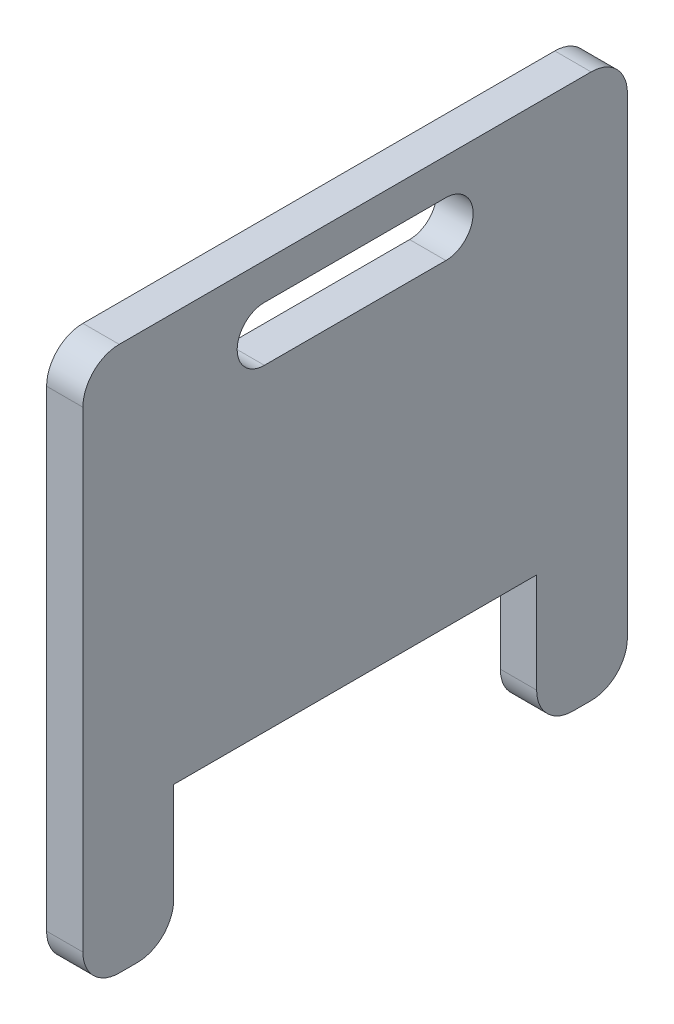
ISO-10303-21;
HEADER;
FILE_DESCRIPTION(('STEP AP214'),'2;1');
FILE_NAME('part.step','',(''),(''),'','','');
FILE_SCHEMA(('AUTOMOTIVE_DESIGN { 1 0 10303 214 1 1 1 1 }'));
ENDSEC;
DATA;
#1=APPLICATION_CONTEXT('core data for automotive mechanical design processes');
#2=APPLICATION_PROTOCOL_DEFINITION('international standard','automotive_design',2000,#1);
#3=PRODUCT_CONTEXT('',#1,'mechanical');
#4=PRODUCT('Part','Part','',(#3));
#5=PRODUCT_RELATED_PRODUCT_CATEGORY('part','',(#4));
#6=PRODUCT_DEFINITION_FORMATION('','',#4);
#7=PRODUCT_DEFINITION_CONTEXT('part definition',#1,'design');
#8=PRODUCT_DEFINITION('design','',#6,#7);
#9=PRODUCT_DEFINITION_SHAPE('','',#8);
#10=(LENGTH_UNIT() NAMED_UNIT(*) SI_UNIT(.MILLI.,.METRE.));
#11=(NAMED_UNIT(*) PLANE_ANGLE_UNIT() SI_UNIT($,.RADIAN.));
#12=(NAMED_UNIT(*) SI_UNIT($,.STERADIAN.) SOLID_ANGLE_UNIT());
#13=UNCERTAINTY_MEASURE_WITH_UNIT(LENGTH_MEASURE(1.E-05),#10,'distance_accuracy_value','');
#14=(GEOMETRIC_REPRESENTATION_CONTEXT(3) GLOBAL_UNCERTAINTY_ASSIGNED_CONTEXT((#13)) GLOBAL_UNIT_ASSIGNED_CONTEXT((#10,
#11,#12)) REPRESENTATION_CONTEXT('',''));
#15=CARTESIAN_POINT('',(0.,0.,0.));
#16=DIRECTION('',(0.,0.,1.));
#17=DIRECTION('',(1.,0.,0.));
#18=AXIS2_PLACEMENT_3D('',#15,#16,#17);
#19=CARTESIAN_POINT('',(10.,37.5,-150.));
#20=DIRECTION('',(0.,1.,0.));
#21=DIRECTION('',(0.,0.,1.));
#22=AXIS2_PLACEMENT_3D('',#19,#20,#21);
#23=PLANE('',#22);
#24=DIRECTION('',(0.,0.,-1.));
#25=VECTOR('',#24,1.);
#26=CARTESIAN_POINT('',(0.,37.5,-150.));
#27=LINE('',#26,#25);
#28=CARTESIAN_POINT('',(0.,37.5,-135.));
#29=VERTEX_POINT('',#28);
#30=CARTESIAN_POINT('',(0.,37.5,-140.));
#31=VERTEX_POINT('',#30);
#32=EDGE_CURVE('E224',#29,#31,#27,.T.);
#33=ORIENTED_EDGE('',*,*,#32,.T.);
#34=DIRECTION('',(-1.,0.,0.));
#35=VECTOR('',#34,1.);
#36=CARTESIAN_POINT('',(10.,37.5,-140.));
#37=LINE('',#36,#35);
#38=CARTESIAN_POINT('',(10.,37.5,-140.));
#39=VERTEX_POINT('',#38);
#40=EDGE_CURVE('E252',#31,#39,#37,.F.);
#41=ORIENTED_EDGE('',*,*,#40,.T.);
#42=DIRECTION('',(0.,0.,-1.));
#43=VECTOR('',#42,1.);
#44=CARTESIAN_POINT('',(10.,37.5,-150.));
#45=LINE('',#44,#43);
#46=CARTESIAN_POINT('',(10.,37.5,-135.));
#47=VERTEX_POINT('',#46);
#48=EDGE_CURVE('E210',#47,#39,#45,.T.);
#49=ORIENTED_EDGE('',*,*,#48,.F.);
#50=DIRECTION('',(-1.,0.,0.));
#51=VECTOR('',#50,1.);
#52=CARTESIAN_POINT('',(10.,37.5,-135.));
#53=LINE('',#52,#51);
#54=EDGE_CURVE('E249',#47,#29,#53,.T.);
#55=ORIENTED_EDGE('',*,*,#54,.T.);
#56=EDGE_LOOP('',(#33,#41,#49,#55));
#57=FACE_BOUND('',#56,.T.);
#58=ADVANCED_FACE('F33',(#57),#23,.F.);
#59=CARTESIAN_POINT('',(10.,187.5,0.));
#60=DIRECTION('',(0.,0.,-1.));
#61=DIRECTION('',(-1.,0.,0.));
#62=AXIS2_PLACEMENT_3D('',#59,#60,#61);
#63=PLANE('',#62);
#64=DIRECTION('',(0.,-1.,0.));
#65=VECTOR('',#64,1.);
#66=CARTESIAN_POINT('',(0.,187.5,0.));
#67=LINE('',#66,#65);
#68=CARTESIAN_POINT('',(0.,177.5,0.));
#69=VERTEX_POINT('',#68);
#70=CARTESIAN_POINT('',(0.,47.5,0.));
#71=VERTEX_POINT('',#70);
#72=EDGE_CURVE('E204',#69,#71,#67,.T.);
#73=ORIENTED_EDGE('',*,*,#72,.T.);
#74=DIRECTION('',(-1.,0.,0.));
#75=VECTOR('',#74,1.);
#76=CARTESIAN_POINT('',(10.,47.5,0.));
#77=LINE('',#76,#75);
#78=CARTESIAN_POINT('',(10.,47.5,0.));
#79=VERTEX_POINT('',#78);
#80=EDGE_CURVE('E279',#71,#79,#77,.F.);
#81=ORIENTED_EDGE('',*,*,#80,.T.);
#82=DIRECTION('',(0.,-1.,0.));
#83=VECTOR('',#82,1.);
#84=CARTESIAN_POINT('',(10.,187.5,0.));
#85=LINE('',#84,#83);
#86=CARTESIAN_POINT('',(10.,177.5,0.));
#87=VERTEX_POINT('',#86);
#88=EDGE_CURVE('E207',#87,#79,#85,.T.);
#89=ORIENTED_EDGE('',*,*,#88,.F.);
#90=DIRECTION('',(-1.,0.,0.));
#91=VECTOR('',#90,1.);
#92=CARTESIAN_POINT('',(10.,177.5,0.));
#93=LINE('',#92,#91);
#94=EDGE_CURVE('E276',#87,#69,#93,.T.);
#95=ORIENTED_EDGE('',*,*,#94,.T.);
#96=EDGE_LOOP('',(#73,#81,#89,#95));
#97=FACE_BOUND('',#96,.T.);
#98=ADVANCED_FACE('F309',(#97),#63,.F.);
#99=CARTESIAN_POINT('',(0.,37.5,-10.));
#100=VERTEX_POINT('',#99);
#101=CARTESIAN_POINT('',(0.,37.5,-15.));
#102=VERTEX_POINT('',#101);
#103=EDGE_CURVE('E227',#100,#102,#27,.T.);
#104=ORIENTED_EDGE('',*,*,#103,.T.);
#105=DIRECTION('',(-1.,0.,0.));
#106=VECTOR('',#105,1.);
#107=CARTESIAN_POINT('',(10.,37.5,-15.));
#108=LINE('',#107,#106);
#109=CARTESIAN_POINT('',(10.,37.5,-15.));
#110=VERTEX_POINT('',#109);
#111=EDGE_CURVE('E274',#102,#110,#108,.F.);
#112=ORIENTED_EDGE('',*,*,#111,.T.);
#113=CARTESIAN_POINT('',(10.,37.5,-10.));
#114=VERTEX_POINT('',#113);
#115=EDGE_CURVE('E212',#114,#110,#45,.T.);
#116=ORIENTED_EDGE('',*,*,#115,.F.);
#117=DIRECTION('',(-1.,0.,0.));
#118=VECTOR('',#117,1.);
#119=CARTESIAN_POINT('',(10.,37.5,-10.));
#120=LINE('',#119,#118);
#121=EDGE_CURVE('E271',#114,#100,#120,.T.);
#122=ORIENTED_EDGE('',*,*,#121,.T.);
#123=EDGE_LOOP('',(#104,#112,#116,#122));
#124=FACE_BOUND('',#123,.T.);
#125=ADVANCED_FACE('F312',(#124),#23,.F.);
#126=CARTESIAN_POINT('',(10.,187.5,-150.));
#127=DIRECTION('',(0.,0.,1.));
#128=DIRECTION('',(1.,0.,0.));
#129=AXIS2_PLACEMENT_3D('',#126,#127,#128);
#130=PLANE('',#129);
#131=DIRECTION('',(0.,1.,0.));
#132=VECTOR('',#131,1.);
#133=CARTESIAN_POINT('',(10.,187.5,-150.));
#134=LINE('',#133,#132);
#135=CARTESIAN_POINT('',(10.,47.5,-150.));
#136=VERTEX_POINT('',#135);
#137=CARTESIAN_POINT('',(10.,177.5,-150.));
#138=VERTEX_POINT('',#137);
#139=EDGE_CURVE('E215',#136,#138,#134,.T.);
#140=ORIENTED_EDGE('',*,*,#139,.F.);
#141=DIRECTION('',(-1.,0.,0.));
#142=VECTOR('',#141,1.);
#143=CARTESIAN_POINT('',(10.,47.5,-150.));
#144=LINE('',#143,#142);
#145=CARTESIAN_POINT('',(0.,47.5,-150.));
#146=VERTEX_POINT('',#145);
#147=EDGE_CURVE('E234',#136,#146,#144,.T.);
#148=ORIENTED_EDGE('',*,*,#147,.T.);
#149=DIRECTION('',(0.,1.,0.));
#150=VECTOR('',#149,1.);
#151=CARTESIAN_POINT('',(0.,187.5,-150.));
#152=LINE('',#151,#150);
#153=CARTESIAN_POINT('',(0.,177.5,-150.));
#154=VERTEX_POINT('',#153);
#155=EDGE_CURVE('E228',#146,#154,#152,.T.);
#156=ORIENTED_EDGE('',*,*,#155,.T.);
#157=DIRECTION('',(-1.,0.,0.));
#158=VECTOR('',#157,1.);
#159=CARTESIAN_POINT('',(10.,177.5,-150.));
#160=LINE('',#159,#158);
#161=EDGE_CURVE('E221',#154,#138,#160,.F.);
#162=ORIENTED_EDGE('',*,*,#161,.T.);
#163=EDGE_LOOP('',(#140,#148,#156,#162));
#164=FACE_BOUND('',#163,.T.);
#165=ADVANCED_FACE('F320',(#164),#130,.F.);
#166=CARTESIAN_POINT('',(10.,187.5,-150.));
#167=DIRECTION('',(0.,-1.,0.));
#168=DIRECTION('',(0.,0.,-1.));
#169=AXIS2_PLACEMENT_3D('',#166,#167,#168);
#170=PLANE('',#169);
#171=DIRECTION('',(0.,0.,1.));
#172=VECTOR('',#171,1.);
#173=CARTESIAN_POINT('',(10.,187.5,-150.));
#174=LINE('',#173,#172);
#175=CARTESIAN_POINT('',(10.,187.5,-140.));
#176=VERTEX_POINT('',#175);
#177=CARTESIAN_POINT('',(10.,187.5,-10.));
#178=VERTEX_POINT('',#177);
#179=EDGE_CURVE('E218',#176,#178,#174,.T.);
#180=ORIENTED_EDGE('',*,*,#179,.F.);
#181=DIRECTION('',(-1.,0.,0.));
#182=VECTOR('',#181,1.);
#183=CARTESIAN_POINT('',(10.,187.5,-140.));
#184=LINE('',#183,#182);
#185=CARTESIAN_POINT('',(0.,187.5,-140.));
#186=VERTEX_POINT('',#185);
#187=EDGE_CURVE('E283',#176,#186,#184,.T.);
#188=ORIENTED_EDGE('',*,*,#187,.T.);
#189=DIRECTION('',(0.,0.,1.));
#190=VECTOR('',#189,1.);
#191=CARTESIAN_POINT('',(0.,187.5,-150.));
#192=LINE('',#191,#190);
#193=CARTESIAN_POINT('',(0.,187.5,-10.));
#194=VERTEX_POINT('',#193);
#195=EDGE_CURVE('E211',#186,#194,#192,.T.);
#196=ORIENTED_EDGE('',*,*,#195,.T.);
#197=DIRECTION('',(-1.,0.,0.));
#198=VECTOR('',#197,1.);
#199=CARTESIAN_POINT('',(10.,187.5,-10.));
#200=LINE('',#199,#198);
#201=EDGE_CURVE('E281',#194,#178,#200,.F.);
#202=ORIENTED_EDGE('',*,*,#201,.T.);
#203=EDGE_LOOP('',(#180,#188,#196,#202));
#204=FACE_BOUND('',#203,.T.);
#205=ADVANCED_FACE('F325',(#204),#170,.F.);
#206=CARTESIAN_POINT('',(10.,0.,0.));
#207=DIRECTION('',(-1.,0.,0.));
#208=DIRECTION('',(0.,0.,1.));
#209=AXIS2_PLACEMENT_3D('',#206,#207,#208);
#210=PLANE('',#209);
#211=DIRECTION('',(0.,0.,-1.));
#212=VECTOR('',#211,1.);
#213=CARTESIAN_POINT('',(10.,162.5,-50.));
#214=LINE('',#213,#212);
#215=CARTESIAN_POINT('',(10.,162.5,-50.));
#216=VERTEX_POINT('',#215);
#217=CARTESIAN_POINT('',(10.,162.5,-100.));
#218=VERTEX_POINT('',#217);
#219=EDGE_CURVE('E169',#216,#218,#214,.T.);
#220=ORIENTED_EDGE('',*,*,#219,.F.);
#221=CARTESIAN_POINT('',(10.,170.,-50.));
#222=DIRECTION('',(1.,0.,0.));
#223=DIRECTION('',(0.,0.,-1.));
#224=AXIS2_PLACEMENT_3D('',#221,#222,#223);
#225=CIRCLE('',#224,7.49999999999999);
#226=CARTESIAN_POINT('',(10.,177.5,-50.));
#227=VERTEX_POINT('',#226);
#228=EDGE_CURVE('E48',#227,#216,#225,.T.);
#229=ORIENTED_EDGE('',*,*,#228,.F.);
#230=DIRECTION('',(0.,0.,1.));
#231=VECTOR('',#230,1.);
#232=CARTESIAN_POINT('',(10.,177.5,-50.));
#233=LINE('',#232,#231);
#234=CARTESIAN_POINT('',(10.,177.5,-100.));
#235=VERTEX_POINT('',#234);
#236=EDGE_CURVE('E176',#235,#227,#233,.T.);
#237=ORIENTED_EDGE('',*,*,#236,.F.);
#238=CARTESIAN_POINT('',(10.,170.,-100.));
#239=DIRECTION('',(1.,0.,0.));
#240=DIRECTION('',(0.,0.,-1.));
#241=AXIS2_PLACEMENT_3D('',#238,#239,#240);
#242=CIRCLE('',#241,7.50000000000001);
#243=EDGE_CURVE('E160',#218,#235,#242,.T.);
#244=ORIENTED_EDGE('',*,*,#243,.F.);
#245=EDGE_LOOP('',(#220,#229,#237,#244));
#246=FACE_BOUND('',#245,.T.);
#247=ORIENTED_EDGE('',*,*,#48,.T.);
#248=CARTESIAN_POINT('',(10.,47.5,-140.));
#249=DIRECTION('',(-1.,0.,0.));
#250=DIRECTION('',(0.,0.,1.));
#251=AXIS2_PLACEMENT_3D('',#248,#249,#250);
#252=CIRCLE('',#251,10.);
#253=EDGE_CURVE('E264',#39,#136,#252,.F.);
#254=ORIENTED_EDGE('',*,*,#253,.T.);
#255=ORIENTED_EDGE('',*,*,#139,.T.);
#256=CARTESIAN_POINT('',(10.,177.5,-140.));
#257=DIRECTION('',(-1.,0.,0.));
#258=DIRECTION('',(0.,0.,1.));
#259=AXIS2_PLACEMENT_3D('',#256,#257,#258);
#260=CIRCLE('',#259,10.);
#261=EDGE_CURVE('E256',#138,#176,#260,.F.);
#262=ORIENTED_EDGE('',*,*,#261,.T.);
#263=ORIENTED_EDGE('',*,*,#179,.T.);
#264=CARTESIAN_POINT('',(10.,177.5,-10.));
#265=DIRECTION('',(-1.,0.,0.));
#266=DIRECTION('',(0.,0.,1.));
#267=AXIS2_PLACEMENT_3D('',#264,#265,#266);
#268=CIRCLE('',#267,10.);
#269=EDGE_CURVE('E254',#178,#87,#268,.F.);
#270=ORIENTED_EDGE('',*,*,#269,.T.);
#271=ORIENTED_EDGE('',*,*,#88,.T.);
#272=CARTESIAN_POINT('',(10.,47.5,-10.));
#273=DIRECTION('',(-1.,0.,0.));
#274=DIRECTION('',(0.,0.,1.));
#275=AXIS2_PLACEMENT_3D('',#272,#273,#274);
#276=CIRCLE('',#275,10.);
#277=EDGE_CURVE('E258',#79,#114,#276,.F.);
#278=ORIENTED_EDGE('',*,*,#277,.T.);
#279=ORIENTED_EDGE('',*,*,#115,.T.);
#280=CARTESIAN_POINT('',(10.,47.5,-15.));
#281=DIRECTION('',(-1.,0.,0.));
#282=DIRECTION('',(0.,0.,1.));
#283=AXIS2_PLACEMENT_3D('',#280,#281,#282);
#284=CIRCLE('',#283,10.);
#285=CARTESIAN_POINT('',(10.,47.5,-25.));
#286=VERTEX_POINT('',#285);
#287=EDGE_CURVE('E260',#110,#286,#284,.F.);
#288=ORIENTED_EDGE('',*,*,#287,.T.);
#289=DIRECTION('',(0.,1.,0.));
#290=VECTOR('',#289,1.);
#291=CARTESIAN_POINT('',(10.,37.5,-25.));
#292=LINE('',#291,#290);
#293=CARTESIAN_POINT('',(10.,75.,-25.));
#294=VERTEX_POINT('',#293);
#295=EDGE_CURVE('E189',#286,#294,#292,.T.);
#296=ORIENTED_EDGE('',*,*,#295,.T.);
#297=DIRECTION('',(0.,0.,-1.));
#298=VECTOR('',#297,1.);
#299=CARTESIAN_POINT('',(10.,75.,-125.));
#300=LINE('',#299,#298);
#301=CARTESIAN_POINT('',(10.,75.,-125.));
#302=VERTEX_POINT('',#301);
#303=EDGE_CURVE('E192',#294,#302,#300,.T.);
#304=ORIENTED_EDGE('',*,*,#303,.T.);
#305=DIRECTION('',(0.,-1.,0.));
#306=VECTOR('',#305,1.);
#307=CARTESIAN_POINT('',(10.,37.5,-125.));
#308=LINE('',#307,#306);
#309=CARTESIAN_POINT('',(10.,47.5,-125.));
#310=VERTEX_POINT('',#309);
#311=EDGE_CURVE('E186',#302,#310,#308,.T.);
#312=ORIENTED_EDGE('',*,*,#311,.T.);
#313=CARTESIAN_POINT('',(10.,47.5,-135.));
#314=DIRECTION('',(-1.,0.,0.));
#315=DIRECTION('',(0.,0.,1.));
#316=AXIS2_PLACEMENT_3D('',#313,#314,#315);
#317=CIRCLE('',#316,10.);
#318=EDGE_CURVE('E262',#310,#47,#317,.F.);
#319=ORIENTED_EDGE('',*,*,#318,.T.);
#320=EDGE_LOOP('',(#247,#254,#255,#262,#263,#270,#271,#278,#279,#288,#296,#304,#312,#319));
#321=FACE_BOUND('',#320,.T.);
#322=ADVANCED_FACE('F173',(#246,#321),#210,.F.);
#323=CARTESIAN_POINT('',(0.,0.,0.));
#324=DIRECTION('',(-1.,0.,0.));
#325=DIRECTION('',(0.,0.,1.));
#326=AXIS2_PLACEMENT_3D('',#323,#324,#325);
#327=PLANE('',#326);
#328=CARTESIAN_POINT('',(0.,170.,-50.));
#329=DIRECTION('',(-1.,0.,0.));
#330=DIRECTION('',(0.,0.,1.));
#331=AXIS2_PLACEMENT_3D('',#328,#329,#330);
#332=CIRCLE('',#331,7.49999999999999);
#333=CARTESIAN_POINT('',(0.,162.5,-50.));
#334=VERTEX_POINT('',#333);
#335=CARTESIAN_POINT('',(0.,177.5,-50.));
#336=VERTEX_POINT('',#335);
#337=EDGE_CURVE('E11',#334,#336,#332,.T.);
#338=ORIENTED_EDGE('',*,*,#337,.F.);
#339=DIRECTION('',(0.,0.,1.));
#340=VECTOR('',#339,1.);
#341=CARTESIAN_POINT('',(0.,162.5,0.));
#342=LINE('',#341,#340);
#343=CARTESIAN_POINT('',(0.,162.5,-100.));
#344=VERTEX_POINT('',#343);
#345=EDGE_CURVE('E286',#344,#334,#342,.T.);
#346=ORIENTED_EDGE('',*,*,#345,.F.);
#347=CARTESIAN_POINT('',(0.,170.,-100.));
#348=DIRECTION('',(-1.,0.,0.));
#349=DIRECTION('',(0.,0.,1.));
#350=AXIS2_PLACEMENT_3D('',#347,#348,#349);
#351=CIRCLE('',#350,7.50000000000001);
#352=CARTESIAN_POINT('',(0.,177.5,-100.));
#353=VERTEX_POINT('',#352);
#354=EDGE_CURVE('E163',#353,#344,#351,.T.);
#355=ORIENTED_EDGE('',*,*,#354,.F.);
#356=DIRECTION('',(0.,0.,-1.));
#357=VECTOR('',#356,1.);
#358=CARTESIAN_POINT('',(0.,177.5,0.));
#359=LINE('',#358,#357);
#360=EDGE_CURVE('E41',#336,#353,#359,.T.);
#361=ORIENTED_EDGE('',*,*,#360,.F.);
#362=EDGE_LOOP('',(#338,#346,#355,#361));
#363=FACE_BOUND('',#362,.T.);
#364=ORIENTED_EDGE('',*,*,#155,.F.);
#365=CARTESIAN_POINT('',(0.,47.5,-140.));
#366=DIRECTION('',(-1.,0.,0.));
#367=DIRECTION('',(0.,0.,1.));
#368=AXIS2_PLACEMENT_3D('',#365,#366,#367);
#369=CIRCLE('',#368,10.);
#370=EDGE_CURVE('E247',#146,#31,#369,.T.);
#371=ORIENTED_EDGE('',*,*,#370,.T.);
#372=ORIENTED_EDGE('',*,*,#32,.F.);
#373=CARTESIAN_POINT('',(0.,47.5,-135.));
#374=DIRECTION('',(-1.,0.,0.));
#375=DIRECTION('',(0.,0.,1.));
#376=AXIS2_PLACEMENT_3D('',#373,#374,#375);
#377=CIRCLE('',#376,10.);
#378=CARTESIAN_POINT('',(0.,47.5,-125.));
#379=VERTEX_POINT('',#378);
#380=EDGE_CURVE('E245',#29,#379,#377,.T.);
#381=ORIENTED_EDGE('',*,*,#380,.T.);
#382=DIRECTION('',(0.,-1.,0.));
#383=VECTOR('',#382,1.);
#384=CARTESIAN_POINT('',(0.,37.5,-125.));
#385=LINE('',#384,#383);
#386=CARTESIAN_POINT('',(0.,75.,-125.));
#387=VERTEX_POINT('',#386);
#388=EDGE_CURVE('E183',#387,#379,#385,.T.);
#389=ORIENTED_EDGE('',*,*,#388,.F.);
#390=DIRECTION('',(0.,0.,-1.));
#391=VECTOR('',#390,1.);
#392=CARTESIAN_POINT('',(0.,75.,-125.));
#393=LINE('',#392,#391);
#394=CARTESIAN_POINT('',(0.,75.,-25.));
#395=VERTEX_POINT('',#394);
#396=EDGE_CURVE('E190',#395,#387,#393,.T.);
#397=ORIENTED_EDGE('',*,*,#396,.F.);
#398=DIRECTION('',(0.,1.,0.));
#399=VECTOR('',#398,1.);
#400=CARTESIAN_POINT('',(0.,37.5,-25.));
#401=LINE('',#400,#399);
#402=CARTESIAN_POINT('',(0.,47.5,-25.));
#403=VERTEX_POINT('',#402);
#404=EDGE_CURVE('E198',#403,#395,#401,.T.);
#405=ORIENTED_EDGE('',*,*,#404,.F.);
#406=CARTESIAN_POINT('',(0.,47.5,-15.));
#407=DIRECTION('',(-1.,0.,0.));
#408=DIRECTION('',(0.,0.,1.));
#409=AXIS2_PLACEMENT_3D('',#406,#407,#408);
#410=CIRCLE('',#409,10.);
#411=EDGE_CURVE('E243',#403,#102,#410,.T.);
#412=ORIENTED_EDGE('',*,*,#411,.T.);
#413=ORIENTED_EDGE('',*,*,#103,.F.);
#414=CARTESIAN_POINT('',(0.,47.5,-10.));
#415=DIRECTION('',(-1.,0.,0.));
#416=DIRECTION('',(0.,0.,1.));
#417=AXIS2_PLACEMENT_3D('',#414,#415,#416);
#418=CIRCLE('',#417,10.);
#419=EDGE_CURVE('E241',#100,#71,#418,.T.);
#420=ORIENTED_EDGE('',*,*,#419,.T.);
#421=ORIENTED_EDGE('',*,*,#72,.F.);
#422=CARTESIAN_POINT('',(0.,177.5,-10.));
#423=DIRECTION('',(-1.,0.,0.));
#424=DIRECTION('',(0.,0.,1.));
#425=AXIS2_PLACEMENT_3D('',#422,#423,#424);
#426=CIRCLE('',#425,10.);
#427=EDGE_CURVE('E237',#69,#194,#426,.T.);
#428=ORIENTED_EDGE('',*,*,#427,.T.);
#429=ORIENTED_EDGE('',*,*,#195,.F.);
#430=CARTESIAN_POINT('',(0.,177.5,-140.));
#431=DIRECTION('',(-1.,0.,0.));
#432=DIRECTION('',(0.,0.,1.));
#433=AXIS2_PLACEMENT_3D('',#430,#431,#432);
#434=CIRCLE('',#433,10.);
#435=EDGE_CURVE('E239',#186,#154,#434,.T.);
#436=ORIENTED_EDGE('',*,*,#435,.T.);
#437=EDGE_LOOP('',(#364,#371,#372,#381,#389,#397,#405,#412,#413,#420,#421,#428,#429,#436));
#438=FACE_BOUND('',#437,.T.);
#439=ADVANCED_FACE('F294',(#363,#438),#327,.T.);
#440=CARTESIAN_POINT('',(10.,37.5,-125.));
#441=DIRECTION('',(0.,0.,-1.));
#442=DIRECTION('',(-1.,0.,0.));
#443=AXIS2_PLACEMENT_3D('',#440,#441,#442);
#444=PLANE('',#443);
#445=ORIENTED_EDGE('',*,*,#388,.T.);
#446=DIRECTION('',(-1.,0.,0.));
#447=VECTOR('',#446,1.);
#448=CARTESIAN_POINT('',(10.,47.5,-125.));
#449=LINE('',#448,#447);
#450=EDGE_CURVE('E266',#379,#310,#449,.F.);
#451=ORIENTED_EDGE('',*,*,#450,.T.);
#452=ORIENTED_EDGE('',*,*,#311,.F.);
#453=DIRECTION('',(-1.,0.,0.));
#454=VECTOR('',#453,1.);
#455=CARTESIAN_POINT('',(10.,75.,-125.));
#456=LINE('',#455,#454);
#457=EDGE_CURVE('E202',#302,#387,#456,.T.);
#458=ORIENTED_EDGE('',*,*,#457,.T.);
#459=EDGE_LOOP('',(#445,#451,#452,#458));
#460=FACE_BOUND('',#459,.T.);
#461=ADVANCED_FACE('F397',(#460),#444,.F.);
#462=CARTESIAN_POINT('',(10.,75.,-125.));
#463=DIRECTION('',(0.,1.,0.));
#464=DIRECTION('',(0.,0.,1.));
#465=AXIS2_PLACEMENT_3D('',#462,#463,#464);
#466=PLANE('',#465);
#467=ORIENTED_EDGE('',*,*,#396,.T.);
#468=ORIENTED_EDGE('',*,*,#457,.F.);
#469=ORIENTED_EDGE('',*,*,#303,.F.);
#470=DIRECTION('',(-1.,0.,0.));
#471=VECTOR('',#470,1.);
#472=CARTESIAN_POINT('',(10.,75.,-25.));
#473=LINE('',#472,#471);
#474=EDGE_CURVE('E195',#294,#395,#473,.T.);
#475=ORIENTED_EDGE('',*,*,#474,.T.);
#476=EDGE_LOOP('',(#467,#468,#469,#475));
#477=FACE_BOUND('',#476,.T.);
#478=ADVANCED_FACE('F345',(#477),#466,.F.);
#479=CARTESIAN_POINT('',(10.,37.5,-25.));
#480=DIRECTION('',(0.,0.,1.));
#481=DIRECTION('',(1.,0.,0.));
#482=AXIS2_PLACEMENT_3D('',#479,#480,#481);
#483=PLANE('',#482);
#484=ORIENTED_EDGE('',*,*,#295,.F.);
#485=DIRECTION('',(-1.,0.,0.));
#486=VECTOR('',#485,1.);
#487=CARTESIAN_POINT('',(10.,47.5,-25.));
#488=LINE('',#487,#486);
#489=EDGE_CURVE('E268',#286,#403,#488,.T.);
#490=ORIENTED_EDGE('',*,*,#489,.T.);
#491=ORIENTED_EDGE('',*,*,#404,.T.);
#492=ORIENTED_EDGE('',*,*,#474,.F.);
#493=EDGE_LOOP('',(#484,#490,#491,#492));
#494=FACE_BOUND('',#493,.T.);
#495=ADVANCED_FACE('F340',(#494),#483,.F.);
#496=CARTESIAN_POINT('',(10.,47.5,-140.));
#497=DIRECTION('',(-1.,0.,0.));
#498=DIRECTION('',(0.,0.,1.));
#499=AXIS2_PLACEMENT_3D('',#496,#497,#498);
#500=CYLINDRICAL_SURFACE('',#499,10.);
#501=ORIENTED_EDGE('',*,*,#253,.F.);
#502=ORIENTED_EDGE('',*,*,#40,.F.);
#503=ORIENTED_EDGE('',*,*,#370,.F.);
#504=ORIENTED_EDGE('',*,*,#147,.F.);
#505=EDGE_LOOP('',(#501,#502,#503,#504));
#506=FACE_BOUND('',#505,.T.);
#507=ADVANCED_FACE('F361',(#506),#500,.T.);
#508=CARTESIAN_POINT('',(10.,47.5,-135.));
#509=DIRECTION('',(-1.,0.,0.));
#510=DIRECTION('',(0.,0.,1.));
#511=AXIS2_PLACEMENT_3D('',#508,#509,#510);
#512=CYLINDRICAL_SURFACE('',#511,10.);
#513=ORIENTED_EDGE('',*,*,#318,.F.);
#514=ORIENTED_EDGE('',*,*,#450,.F.);
#515=ORIENTED_EDGE('',*,*,#380,.F.);
#516=ORIENTED_EDGE('',*,*,#54,.F.);
#517=EDGE_LOOP('',(#513,#514,#515,#516));
#518=FACE_BOUND('',#517,.T.);
#519=ADVANCED_FACE('F353',(#518),#512,.T.);
#520=CARTESIAN_POINT('',(10.,47.5,-15.));
#521=DIRECTION('',(-1.,0.,0.));
#522=DIRECTION('',(0.,0.,1.));
#523=AXIS2_PLACEMENT_3D('',#520,#521,#522);
#524=CYLINDRICAL_SURFACE('',#523,10.);
#525=ORIENTED_EDGE('',*,*,#287,.F.);
#526=ORIENTED_EDGE('',*,*,#111,.F.);
#527=ORIENTED_EDGE('',*,*,#411,.F.);
#528=ORIENTED_EDGE('',*,*,#489,.F.);
#529=EDGE_LOOP('',(#525,#526,#527,#528));
#530=FACE_BOUND('',#529,.T.);
#531=ADVANCED_FACE('F334',(#530),#524,.T.);
#532=CARTESIAN_POINT('',(10.,47.5,-10.));
#533=DIRECTION('',(-1.,0.,0.));
#534=DIRECTION('',(0.,0.,1.));
#535=AXIS2_PLACEMENT_3D('',#532,#533,#534);
#536=CYLINDRICAL_SURFACE('',#535,10.);
#537=ORIENTED_EDGE('',*,*,#277,.F.);
#538=ORIENTED_EDGE('',*,*,#80,.F.);
#539=ORIENTED_EDGE('',*,*,#419,.F.);
#540=ORIENTED_EDGE('',*,*,#121,.F.);
#541=EDGE_LOOP('',(#537,#538,#539,#540));
#542=FACE_BOUND('',#541,.T.);
#543=ADVANCED_FACE('F378',(#542),#536,.T.);
#544=CARTESIAN_POINT('',(10.,177.5,-140.));
#545=DIRECTION('',(-1.,0.,0.));
#546=DIRECTION('',(0.,0.,1.));
#547=AXIS2_PLACEMENT_3D('',#544,#545,#546);
#548=CYLINDRICAL_SURFACE('',#547,10.);
#549=ORIENTED_EDGE('',*,*,#261,.F.);
#550=ORIENTED_EDGE('',*,*,#161,.F.);
#551=ORIENTED_EDGE('',*,*,#435,.F.);
#552=ORIENTED_EDGE('',*,*,#187,.F.);
#553=EDGE_LOOP('',(#549,#550,#551,#552));
#554=FACE_BOUND('',#553,.T.);
#555=ADVANCED_FACE('F304',(#554),#548,.T.);
#556=CARTESIAN_POINT('',(10.,177.5,-10.));
#557=DIRECTION('',(-1.,0.,0.));
#558=DIRECTION('',(0.,0.,1.));
#559=AXIS2_PLACEMENT_3D('',#556,#557,#558);
#560=CYLINDRICAL_SURFACE('',#559,10.);
#561=ORIENTED_EDGE('',*,*,#269,.F.);
#562=ORIENTED_EDGE('',*,*,#201,.F.);
#563=ORIENTED_EDGE('',*,*,#427,.F.);
#564=ORIENTED_EDGE('',*,*,#94,.F.);
#565=EDGE_LOOP('',(#561,#562,#563,#564));
#566=FACE_BOUND('',#565,.T.);
#567=ADVANCED_FACE('F35',(#566),#560,.T.);
#568=CARTESIAN_POINT('',(-25.,170.,-50.));
#569=DIRECTION('',(1.,0.,0.));
#570=DIRECTION('',(0.,0.,-1.));
#571=AXIS2_PLACEMENT_3D('',#568,#569,#570);
#572=CYLINDRICAL_SURFACE('',#571,7.49999999999999);
#573=ORIENTED_EDGE('',*,*,#337,.T.);
#574=DIRECTION('',(1.,0.,0.));
#575=VECTOR('',#574,1.);
#576=CARTESIAN_POINT('',(-25.,177.5,-50.));
#577=LINE('',#576,#575);
#578=EDGE_CURVE('E181',#336,#227,#577,.T.);
#579=ORIENTED_EDGE('',*,*,#578,.T.);
#580=ORIENTED_EDGE('',*,*,#228,.T.);
#581=DIRECTION('',(1.,0.,0.));
#582=VECTOR('',#581,1.);
#583=CARTESIAN_POINT('',(-25.,162.5,-50.));
#584=LINE('',#583,#582);
#585=EDGE_CURVE('E166',#334,#216,#584,.T.);
#586=ORIENTED_EDGE('',*,*,#585,.F.);
#587=EDGE_LOOP('',(#573,#579,#580,#586));
#588=FACE_BOUND('',#587,.T.);
#589=ADVANCED_FACE('F296',(#588),#572,.F.);
#590=CARTESIAN_POINT('',(-25.,177.5,-50.));
#591=DIRECTION('',(0.,1.,0.));
#592=DIRECTION('',(0.,0.,1.));
#593=AXIS2_PLACEMENT_3D('',#590,#591,#592);
#594=PLANE('',#593);
#595=ORIENTED_EDGE('',*,*,#360,.T.);
#596=DIRECTION('',(1.,0.,0.));
#597=VECTOR('',#596,1.);
#598=CARTESIAN_POINT('',(-25.,177.5,-100.));
#599=LINE('',#598,#597);
#600=EDGE_CURVE('E165',#353,#235,#599,.T.);
#601=ORIENTED_EDGE('',*,*,#600,.T.);
#602=ORIENTED_EDGE('',*,*,#236,.T.);
#603=ORIENTED_EDGE('',*,*,#578,.F.);
#604=EDGE_LOOP('',(#595,#601,#602,#603));
#605=FACE_BOUND('',#604,.T.);
#606=ADVANCED_FACE('F291',(#605),#594,.F.);
#607=CARTESIAN_POINT('',(-25.,170.,-100.));
#608=DIRECTION('',(1.,0.,0.));
#609=DIRECTION('',(0.,0.,-1.));
#610=AXIS2_PLACEMENT_3D('',#607,#608,#609);
#611=CYLINDRICAL_SURFACE('',#610,7.50000000000001);
#612=ORIENTED_EDGE('',*,*,#354,.T.);
#613=DIRECTION('',(1.,0.,0.));
#614=VECTOR('',#613,1.);
#615=CARTESIAN_POINT('',(-25.,162.5,-100.));
#616=LINE('',#615,#614);
#617=EDGE_CURVE('E56',#344,#218,#616,.T.);
#618=ORIENTED_EDGE('',*,*,#617,.T.);
#619=ORIENTED_EDGE('',*,*,#243,.T.);
#620=ORIENTED_EDGE('',*,*,#600,.F.);
#621=EDGE_LOOP('',(#612,#618,#619,#620));
#622=FACE_BOUND('',#621,.T.);
#623=ADVANCED_FACE('F157',(#622),#611,.F.);
#624=CARTESIAN_POINT('',(-25.,162.5,-50.));
#625=DIRECTION('',(0.,-1.,0.));
#626=DIRECTION('',(0.,0.,-1.));
#627=AXIS2_PLACEMENT_3D('',#624,#625,#626);
#628=PLANE('',#627);
#629=ORIENTED_EDGE('',*,*,#345,.T.);
#630=ORIENTED_EDGE('',*,*,#585,.T.);
#631=ORIENTED_EDGE('',*,*,#219,.T.);
#632=ORIENTED_EDGE('',*,*,#617,.F.);
#633=EDGE_LOOP('',(#629,#630,#631,#632));
#634=FACE_BOUND('',#633,.T.);
#635=ADVANCED_FACE('F170',(#634),#628,.F.);
#636=CLOSED_SHELL('',(#58,#98,#125,#165,#205,#322,#439,#461,#478,#495,#507,#519,#531,#543,#555,
#567,#589,#606,#623,#635));
#637=MANIFOLD_SOLID_BREP('B2',#636);
#638=ADVANCED_BREP_SHAPE_REPRESENTATION('',(#18,#637),#14);
#639=SHAPE_DEFINITION_REPRESENTATION(#9,#638);
ENDSEC;
END-ISO-10303-21;
